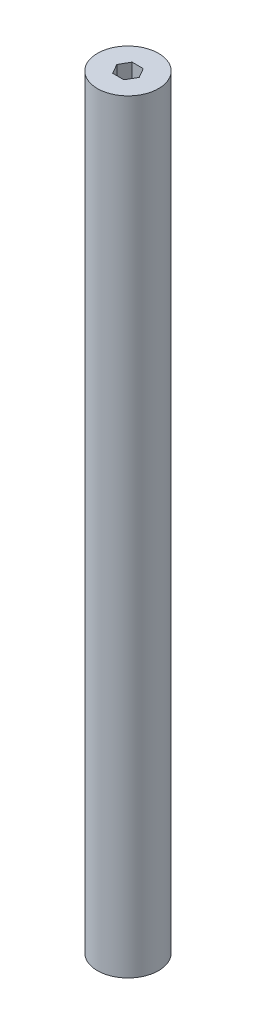
ISO-10303-21;
HEADER;
FILE_DESCRIPTION(('STEP AP214'),'2;1');
FILE_NAME('part.step','',(''),(''),'','','');
FILE_SCHEMA(('AUTOMOTIVE_DESIGN { 1 0 10303 214 1 1 1 1 }'));
ENDSEC;
DATA;
#1=APPLICATION_CONTEXT('core data for automotive mechanical design processes');
#2=APPLICATION_PROTOCOL_DEFINITION('international standard','automotive_design',2000,#1);
#3=PRODUCT_CONTEXT('',#1,'mechanical');
#4=PRODUCT('Part','Part','',(#3));
#5=PRODUCT_RELATED_PRODUCT_CATEGORY('part','',(#4));
#6=PRODUCT_DEFINITION_FORMATION('','',#4);
#7=PRODUCT_DEFINITION_CONTEXT('part definition',#1,'design');
#8=PRODUCT_DEFINITION('design','',#6,#7);
#9=PRODUCT_DEFINITION_SHAPE('','',#8);
#10=(LENGTH_UNIT() NAMED_UNIT(*) SI_UNIT(.MILLI.,.METRE.));
#11=(NAMED_UNIT(*) PLANE_ANGLE_UNIT() SI_UNIT($,.RADIAN.));
#12=(NAMED_UNIT(*) SI_UNIT($,.STERADIAN.) SOLID_ANGLE_UNIT());
#13=UNCERTAINTY_MEASURE_WITH_UNIT(LENGTH_MEASURE(1.E-05),#10,'distance_accuracy_value','');
#14=(GEOMETRIC_REPRESENTATION_CONTEXT(3) GLOBAL_UNCERTAINTY_ASSIGNED_CONTEXT((#13)) GLOBAL_UNIT_ASSIGNED_CONTEXT((#10,
#11,#12)) REPRESENTATION_CONTEXT('',''));
#15=CARTESIAN_POINT('',(0.,0.,0.));
#16=DIRECTION('',(0.,0.,1.));
#17=DIRECTION('',(1.,0.,0.));
#18=AXIS2_PLACEMENT_3D('',#15,#16,#17);
#19=CARTESIAN_POINT('',(0.,1500.,0.));
#20=DIRECTION('',(0.,-1.,0.));
#21=DIRECTION('',(0.,0.,-1.));
#22=AXIS2_PLACEMENT_3D('',#19,#20,#21);
#23=CYLINDRICAL_SURFACE('',#22,60.);
#24=CARTESIAN_POINT('',(0.,1500.,0.));
#25=DIRECTION('',(0.,1.,0.));
#26=DIRECTION('',(0.,0.,1.));
#27=AXIS2_PLACEMENT_3D('',#24,#25,#26);
#28=CIRCLE('',#27,60.);
#29=CARTESIAN_POINT('',(0.,1500.,60.));
#30=VERTEX_POINT('',#29);
#31=EDGE_CURVE('E11',#30,#30,#28,.T.);
#32=ORIENTED_EDGE('',*,*,#31,.F.);
#33=EDGE_LOOP('',(#32));
#34=FACE_BOUND('',#33,.T.);
#35=CARTESIAN_POINT('',(0.,0.,0.));
#36=DIRECTION('',(0.,1.,0.));
#37=DIRECTION('',(0.,0.,1.));
#38=AXIS2_PLACEMENT_3D('',#35,#36,#37);
#39=CIRCLE('',#38,60.);
#40=CARTESIAN_POINT('',(0.,0.,60.));
#41=VERTEX_POINT('',#40);
#42=EDGE_CURVE('E37',#41,#41,#39,.T.);
#43=ORIENTED_EDGE('',*,*,#42,.T.);
#44=EDGE_LOOP('',(#43));
#45=FACE_BOUND('',#44,.T.);
#46=ADVANCED_FACE('F34',(#34,#45),#23,.T.);
#47=CARTESIAN_POINT('',(0.,1500.,0.));
#48=DIRECTION('',(0.,1.,0.));
#49=DIRECTION('',(0.,0.,1.));
#50=AXIS2_PLACEMENT_3D('',#47,#48,#49);
#51=PLANE('',#50);
#52=DIRECTION('',(-1.,0.,0.));
#53=VECTOR('',#52,1.);
#54=CARTESIAN_POINT('',(10.9985226280624,1500.,-19.05));
#55=LINE('',#54,#53);
#56=CARTESIAN_POINT('',(10.9985226280624,1500.,-19.05));
#57=VERTEX_POINT('',#56);
#58=CARTESIAN_POINT('',(-10.9985226280624,1500.,-19.05));
#59=VERTEX_POINT('',#58);
#60=EDGE_CURVE('E48',#57,#59,#55,.T.);
#61=ORIENTED_EDGE('',*,*,#60,.F.);
#62=DIRECTION('',(-0.5,0.,-0.866025403784438));
#63=VECTOR('',#62,1.);
#64=CARTESIAN_POINT('',(21.9970452561247,1500.,0.));
#65=LINE('',#64,#63);
#66=CARTESIAN_POINT('',(21.9970452561247,1500.,0.));
#67=VERTEX_POINT('',#66);
#68=EDGE_CURVE('E94',#67,#57,#65,.T.);
#69=ORIENTED_EDGE('',*,*,#68,.F.);
#70=DIRECTION('',(0.5,0.,-0.866025403784439));
#71=VECTOR('',#70,1.);
#72=CARTESIAN_POINT('',(10.9985226280624,1500.,19.05));
#73=LINE('',#72,#71);
#74=CARTESIAN_POINT('',(10.9985226280624,1500.,19.05));
#75=VERTEX_POINT('',#74);
#76=EDGE_CURVE('E121',#75,#67,#73,.T.);
#77=ORIENTED_EDGE('',*,*,#76,.F.);
#78=DIRECTION('',(1.,0.,0.));
#79=VECTOR('',#78,1.);
#80=CARTESIAN_POINT('',(-10.9985226280624,1500.,19.05));
#81=LINE('',#80,#79);
#82=CARTESIAN_POINT('',(-10.9985226280624,1500.,19.05));
#83=VERTEX_POINT('',#82);
#84=EDGE_CURVE('E118',#83,#75,#81,.T.);
#85=ORIENTED_EDGE('',*,*,#84,.F.);
#86=DIRECTION('',(0.5,0.,0.866025403784438));
#87=VECTOR('',#86,1.);
#88=CARTESIAN_POINT('',(-21.9970452561247,1500.,0.));
#89=LINE('',#88,#87);
#90=CARTESIAN_POINT('',(-21.9970452561247,1500.,0.));
#91=VERTEX_POINT('',#90);
#92=EDGE_CURVE('E115',#91,#83,#89,.T.);
#93=ORIENTED_EDGE('',*,*,#92,.F.);
#94=DIRECTION('',(-0.499999999999999,0.,0.866025403784439));
#95=VECTOR('',#94,1.);
#96=CARTESIAN_POINT('',(-10.9985226280624,1500.,-19.05));
#97=LINE('',#96,#95);
#98=EDGE_CURVE('E108',#59,#91,#97,.T.);
#99=ORIENTED_EDGE('',*,*,#98,.F.);
#100=EDGE_LOOP('',(#61,#69,#77,#85,#93,#99));
#101=FACE_BOUND('',#100,.T.);
#102=ORIENTED_EDGE('',*,*,#31,.T.);
#103=EDGE_LOOP('',(#102));
#104=FACE_BOUND('',#103,.T.);
#105=ADVANCED_FACE('F137',(#101,#104),#51,.T.);
#106=CARTESIAN_POINT('',(0.,0.,0.));
#107=DIRECTION('',(0.,1.,0.));
#108=DIRECTION('',(0.,0.,1.));
#109=AXIS2_PLACEMENT_3D('',#106,#107,#108);
#110=PLANE('',#109);
#111=DIRECTION('',(0.5,0.,0.866025403784439));
#112=VECTOR('',#111,1.);
#113=CARTESIAN_POINT('',(21.9970452561247,0.,0.));
#114=LINE('',#113,#112);
#115=CARTESIAN_POINT('',(10.9985226280624,0.,-19.05));
#116=VERTEX_POINT('',#115);
#117=CARTESIAN_POINT('',(21.9970452561247,0.,0.));
#118=VERTEX_POINT('',#117);
#119=EDGE_CURVE('E106',#116,#118,#114,.T.);
#120=ORIENTED_EDGE('',*,*,#119,.F.);
#121=DIRECTION('',(1.,0.,0.));
#122=VECTOR('',#121,1.);
#123=CARTESIAN_POINT('',(10.9985226280624,0.,-19.05));
#124=LINE('',#123,#122);
#125=CARTESIAN_POINT('',(-10.9985226280624,0.,-19.05));
#126=VERTEX_POINT('',#125);
#127=EDGE_CURVE('E88',#126,#116,#124,.T.);
#128=ORIENTED_EDGE('',*,*,#127,.F.);
#129=DIRECTION('',(0.5,0.,-0.866025403784439));
#130=VECTOR('',#129,1.);
#131=CARTESIAN_POINT('',(-10.9985226280624,0.,-19.05));
#132=LINE('',#131,#130);
#133=CARTESIAN_POINT('',(-21.9970452561247,0.,0.));
#134=VERTEX_POINT('',#133);
#135=EDGE_CURVE('E97',#134,#126,#132,.T.);
#136=ORIENTED_EDGE('',*,*,#135,.F.);
#137=DIRECTION('',(-0.5,0.,-0.866025403784438));
#138=VECTOR('',#137,1.);
#139=CARTESIAN_POINT('',(-21.9970452561247,0.,0.));
#140=LINE('',#139,#138);
#141=CARTESIAN_POINT('',(-10.9985226280624,0.,19.05));
#142=VERTEX_POINT('',#141);
#143=EDGE_CURVE('E56',#142,#134,#140,.T.);
#144=ORIENTED_EDGE('',*,*,#143,.F.);
#145=DIRECTION('',(-1.,0.,0.));
#146=VECTOR('',#145,1.);
#147=CARTESIAN_POINT('',(-10.9985226280624,0.,19.05));
#148=LINE('',#147,#146);
#149=CARTESIAN_POINT('',(10.9985226280624,0.,19.05));
#150=VERTEX_POINT('',#149);
#151=EDGE_CURVE('E146',#150,#142,#148,.T.);
#152=ORIENTED_EDGE('',*,*,#151,.F.);
#153=DIRECTION('',(-0.5,0.,0.866025403784439));
#154=VECTOR('',#153,1.);
#155=CARTESIAN_POINT('',(10.9985226280624,0.,19.05));
#156=LINE('',#155,#154);
#157=EDGE_CURVE('E110',#118,#150,#156,.T.);
#158=ORIENTED_EDGE('',*,*,#157,.F.);
#159=EDGE_LOOP('',(#120,#128,#136,#144,#152,#158));
#160=FACE_BOUND('',#159,.T.);
#161=ORIENTED_EDGE('',*,*,#42,.F.);
#162=EDGE_LOOP('',(#161));
#163=FACE_BOUND('',#162,.T.);
#164=ADVANCED_FACE('F102',(#160,#163),#110,.F.);
#165=CARTESIAN_POINT('',(10.9985226280624,-0.000999999999917733,-19.05));
#166=DIRECTION('',(0.,0.,-1.));
#167=DIRECTION('',(-1.,0.,0.));
#168=AXIS2_PLACEMENT_3D('',#165,#166,#167);
#169=PLANE('',#168);
#170=ORIENTED_EDGE('',*,*,#127,.T.);
#171=DIRECTION('',(0.,1.,0.));
#172=VECTOR('',#171,1.);
#173=CARTESIAN_POINT('',(10.9985226280624,-0.000999999999917733,-19.05));
#174=LINE('',#173,#172);
#175=EDGE_CURVE('E100',#116,#57,#174,.T.);
#176=ORIENTED_EDGE('',*,*,#175,.T.);
#177=ORIENTED_EDGE('',*,*,#60,.T.);
#178=DIRECTION('',(0.,1.,0.));
#179=VECTOR('',#178,1.);
#180=CARTESIAN_POINT('',(-10.9985226280624,-0.000999999999917733,-19.05));
#181=LINE('',#180,#179);
#182=EDGE_CURVE('E84',#126,#59,#181,.T.);
#183=ORIENTED_EDGE('',*,*,#182,.F.);
#184=EDGE_LOOP('',(#170,#176,#177,#183));
#185=FACE_BOUND('',#184,.T.);
#186=ADVANCED_FACE('F86',(#185),#169,.F.);
#187=CARTESIAN_POINT('',(21.9970452561247,-0.000999999999917733,0.));
#188=DIRECTION('',(0.866025403784438,0.,-0.5));
#189=DIRECTION('',(-0.5,0.,-0.866025403784439));
#190=AXIS2_PLACEMENT_3D('',#187,#188,#189);
#191=PLANE('',#190);
#192=ORIENTED_EDGE('',*,*,#119,.T.);
#193=DIRECTION('',(0.,1.,0.));
#194=VECTOR('',#193,1.);
#195=CARTESIAN_POINT('',(21.9970452561247,-0.000999999999917733,0.));
#196=LINE('',#195,#194);
#197=EDGE_CURVE('E127',#118,#67,#196,.T.);
#198=ORIENTED_EDGE('',*,*,#197,.T.);
#199=ORIENTED_EDGE('',*,*,#68,.T.);
#200=ORIENTED_EDGE('',*,*,#175,.F.);
#201=EDGE_LOOP('',(#192,#198,#199,#200));
#202=FACE_BOUND('',#201,.T.);
#203=ADVANCED_FACE('F152',(#202),#191,.F.);
#204=CARTESIAN_POINT('',(10.9985226280624,-0.000999999999917733,19.05));
#205=DIRECTION('',(0.866025403784439,0.,0.5));
#206=DIRECTION('',(0.5,0.,-0.866025403784439));
#207=AXIS2_PLACEMENT_3D('',#204,#205,#206);
#208=PLANE('',#207);
#209=ORIENTED_EDGE('',*,*,#157,.T.);
#210=DIRECTION('',(0.,1.,0.));
#211=VECTOR('',#210,1.);
#212=CARTESIAN_POINT('',(10.9985226280624,-0.000999999999917733,19.05));
#213=LINE('',#212,#211);
#214=EDGE_CURVE('E129',#150,#75,#213,.T.);
#215=ORIENTED_EDGE('',*,*,#214,.T.);
#216=ORIENTED_EDGE('',*,*,#76,.T.);
#217=ORIENTED_EDGE('',*,*,#197,.F.);
#218=EDGE_LOOP('',(#209,#215,#216,#217));
#219=FACE_BOUND('',#218,.T.);
#220=ADVANCED_FACE('F150',(#219),#208,.F.);
#221=CARTESIAN_POINT('',(-10.9985226280624,-0.000999999999917733,19.05));
#222=DIRECTION('',(0.,0.,1.));
#223=DIRECTION('',(1.,0.,0.));
#224=AXIS2_PLACEMENT_3D('',#221,#222,#223);
#225=PLANE('',#224);
#226=ORIENTED_EDGE('',*,*,#151,.T.);
#227=DIRECTION('',(0.,1.,0.));
#228=VECTOR('',#227,1.);
#229=CARTESIAN_POINT('',(-10.9985226280624,-0.000999999999917733,19.05));
#230=LINE('',#229,#228);
#231=EDGE_CURVE('E131',#142,#83,#230,.T.);
#232=ORIENTED_EDGE('',*,*,#231,.T.);
#233=ORIENTED_EDGE('',*,*,#84,.T.);
#234=ORIENTED_EDGE('',*,*,#214,.F.);
#235=EDGE_LOOP('',(#226,#232,#233,#234));
#236=FACE_BOUND('',#235,.T.);
#237=ADVANCED_FACE('F143',(#236),#225,.F.);
#238=CARTESIAN_POINT('',(-21.9970452561247,-0.000999999999917733,0.));
#239=DIRECTION('',(-0.866025403784438,0.,0.5));
#240=DIRECTION('',(0.5,0.,0.866025403784438));
#241=AXIS2_PLACEMENT_3D('',#238,#239,#240);
#242=PLANE('',#241);
#243=ORIENTED_EDGE('',*,*,#143,.T.);
#244=DIRECTION('',(0.,1.,0.));
#245=VECTOR('',#244,1.);
#246=CARTESIAN_POINT('',(-21.9970452561247,-0.000999999999917733,0.));
#247=LINE('',#246,#245);
#248=EDGE_CURVE('E93',#134,#91,#247,.T.);
#249=ORIENTED_EDGE('',*,*,#248,.T.);
#250=ORIENTED_EDGE('',*,*,#92,.T.);
#251=ORIENTED_EDGE('',*,*,#231,.F.);
#252=EDGE_LOOP('',(#243,#249,#250,#251));
#253=FACE_BOUND('',#252,.T.);
#254=ADVANCED_FACE('F133',(#253),#242,.F.);
#255=CARTESIAN_POINT('',(-10.9985226280624,-0.000999999999917733,-19.05));
#256=DIRECTION('',(-0.866025403784439,0.,-0.499999999999999));
#257=DIRECTION('',(-0.5,0.,0.866025403784439));
#258=AXIS2_PLACEMENT_3D('',#255,#256,#257);
#259=PLANE('',#258);
#260=ORIENTED_EDGE('',*,*,#135,.T.);
#261=ORIENTED_EDGE('',*,*,#182,.T.);
#262=ORIENTED_EDGE('',*,*,#98,.T.);
#263=ORIENTED_EDGE('',*,*,#248,.F.);
#264=EDGE_LOOP('',(#260,#261,#262,#263));
#265=FACE_BOUND('',#264,.T.);
#266=ADVANCED_FACE('F98',(#265),#259,.F.);
#267=CLOSED_SHELL('',(#46,#105,#164,#186,#203,#220,#237,#254,#266));
#268=MANIFOLD_SOLID_BREP('B2',#267);
#269=ADVANCED_BREP_SHAPE_REPRESENTATION('',(#18,#268),#14);
#270=SHAPE_DEFINITION_REPRESENTATION(#9,#269);
ENDSEC;
END-ISO-10303-21;
